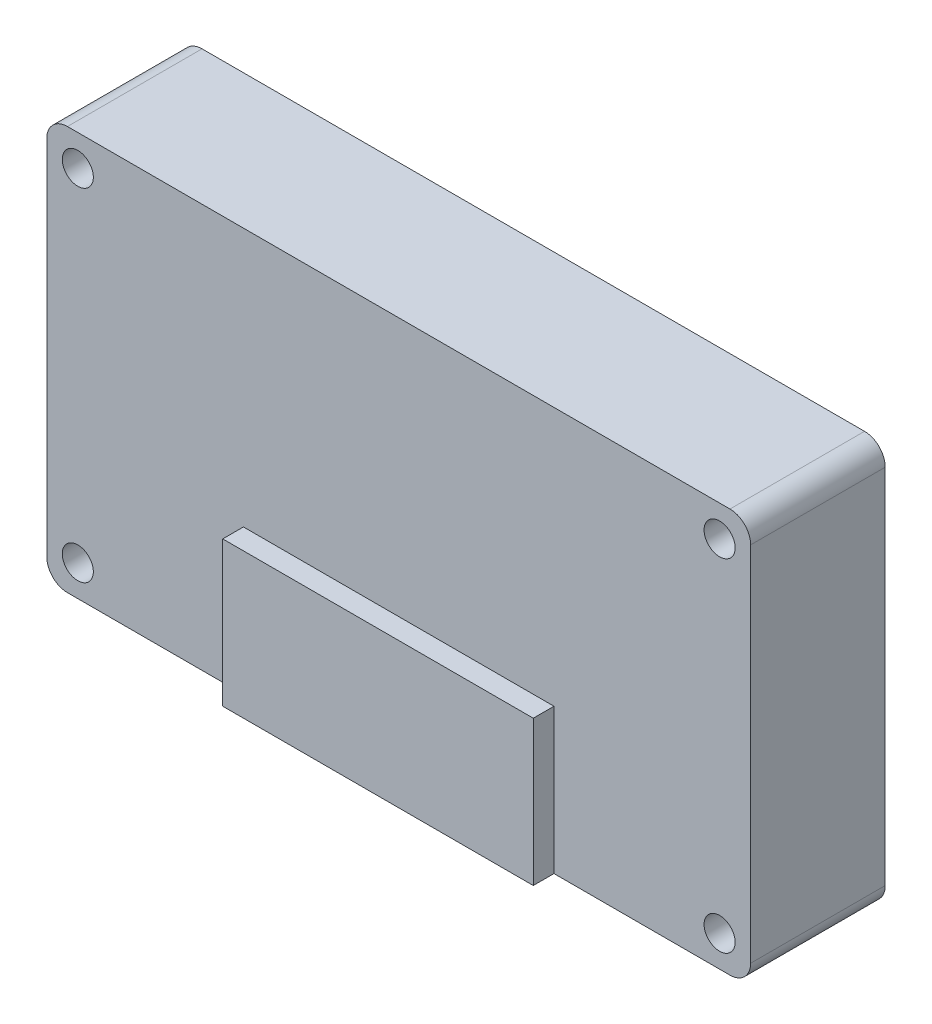
ISO-10303-21;
HEADER;
FILE_DESCRIPTION(('STEP AP214'),'2;1');
FILE_NAME('part.step','',(''),(''),'','','');
FILE_SCHEMA(('AUTOMOTIVE_DESIGN { 1 0 10303 214 1 1 1 1 }'));
ENDSEC;
DATA;
#1=APPLICATION_CONTEXT('core data for automotive mechanical design processes');
#2=APPLICATION_PROTOCOL_DEFINITION('international standard','automotive_design',2000,#1);
#3=PRODUCT_CONTEXT('',#1,'mechanical');
#4=PRODUCT('Part','Part','',(#3));
#5=PRODUCT_RELATED_PRODUCT_CATEGORY('part','',(#4));
#6=PRODUCT_DEFINITION_FORMATION('','',#4);
#7=PRODUCT_DEFINITION_CONTEXT('part definition',#1,'design');
#8=PRODUCT_DEFINITION('design','',#6,#7);
#9=PRODUCT_DEFINITION_SHAPE('','',#8);
#10=(LENGTH_UNIT() NAMED_UNIT(*) SI_UNIT(.MILLI.,.METRE.));
#11=(NAMED_UNIT(*) PLANE_ANGLE_UNIT() SI_UNIT($,.RADIAN.));
#12=(NAMED_UNIT(*) SI_UNIT($,.STERADIAN.) SOLID_ANGLE_UNIT());
#13=UNCERTAINTY_MEASURE_WITH_UNIT(LENGTH_MEASURE(1.E-05),#10,'distance_accuracy_value','');
#14=(GEOMETRIC_REPRESENTATION_CONTEXT(3) GLOBAL_UNCERTAINTY_ASSIGNED_CONTEXT((#13)) GLOBAL_UNIT_ASSIGNED_CONTEXT((#10,
#11,#12)) REPRESENTATION_CONTEXT('',''));
#15=CARTESIAN_POINT('',(0.,0.,0.));
#16=DIRECTION('',(0.,0.,1.));
#17=DIRECTION('',(1.,0.,0.));
#18=AXIS2_PLACEMENT_3D('',#15,#16,#17);
#19=CARTESIAN_POINT('',(0.,0.,13.));
#20=DIRECTION('',(0.,0.,-1.));
#21=DIRECTION('',(-1.,0.,0.));
#22=AXIS2_PLACEMENT_3D('',#19,#20,#21);
#23=PLANE('',#22);
#24=CARTESIAN_POINT('',(65.,3.,13.));
#25=DIRECTION('',(0.,0.,1.));
#26=DIRECTION('',(-1.,0.,0.));
#27=AXIS2_PLACEMENT_3D('',#24,#25,#26);
#28=CIRCLE('',#27,1.5);
#29=CARTESIAN_POINT('',(63.5,3.,13.));
#30=VERTEX_POINT('',#29);
#31=EDGE_CURVE('E161',#30,#30,#28,.T.);
#32=ORIENTED_EDGE('',*,*,#31,.F.);
#33=EDGE_LOOP('',(#32));
#34=FACE_BOUND('',#33,.T.);
#35=CARTESIAN_POINT('',(65.,36.,13.));
#36=DIRECTION('',(0.,0.,1.));
#37=DIRECTION('',(-1.,0.,0.));
#38=AXIS2_PLACEMENT_3D('',#35,#36,#37);
#39=CIRCLE('',#38,1.5);
#40=CARTESIAN_POINT('',(63.5,36.,13.));
#41=VERTEX_POINT('',#40);
#42=EDGE_CURVE('E170',#41,#41,#39,.T.);
#43=ORIENTED_EDGE('',*,*,#42,.F.);
#44=EDGE_LOOP('',(#43));
#45=FACE_BOUND('',#44,.T.);
#46=CARTESIAN_POINT('',(3.,3.,13.));
#47=DIRECTION('',(0.,0.,1.));
#48=DIRECTION('',(1.,0.,0.));
#49=AXIS2_PLACEMENT_3D('',#46,#47,#48);
#50=CIRCLE('',#49,1.5);
#51=CARTESIAN_POINT('',(1.5,3.,13.));
#52=VERTEX_POINT('',#51);
#53=EDGE_CURVE('E176',#52,#52,#50,.T.);
#54=ORIENTED_EDGE('',*,*,#53,.F.);
#55=EDGE_LOOP('',(#54));
#56=FACE_BOUND('',#55,.T.);
#57=CARTESIAN_POINT('',(3.,36.,13.));
#58=DIRECTION('',(0.,0.,1.));
#59=DIRECTION('',(1.,0.,0.));
#60=AXIS2_PLACEMENT_3D('',#57,#58,#59);
#61=CIRCLE('',#60,1.5);
#62=CARTESIAN_POINT('',(1.5,36.,13.));
#63=VERTEX_POINT('',#62);
#64=EDGE_CURVE('E182',#63,#63,#61,.T.);
#65=ORIENTED_EDGE('',*,*,#64,.F.);
#66=EDGE_LOOP('',(#65));
#67=FACE_BOUND('',#66,.T.);
#68=DIRECTION('',(0.,-1.,0.));
#69=VECTOR('',#68,1.);
#70=CARTESIAN_POINT('',(19.,14.,13.));
#71=LINE('',#70,#69);
#72=CARTESIAN_POINT('',(19.,14.,13.));
#73=VERTEX_POINT('',#72);
#74=CARTESIAN_POINT('',(19.,0.,13.));
#75=VERTEX_POINT('',#74);
#76=EDGE_CURVE('E62',#73,#75,#71,.T.);
#77=ORIENTED_EDGE('',*,*,#76,.F.);
#78=DIRECTION('',(-1.,0.,0.));
#79=VECTOR('',#78,1.);
#80=CARTESIAN_POINT('',(19.,14.,13.));
#81=LINE('',#80,#79);
#82=CARTESIAN_POINT('',(49.,14.,13.));
#83=VERTEX_POINT('',#82);
#84=EDGE_CURVE('E155',#83,#73,#81,.T.);
#85=ORIENTED_EDGE('',*,*,#84,.F.);
#86=DIRECTION('',(0.,1.,0.));
#87=VECTOR('',#86,1.);
#88=CARTESIAN_POINT('',(49.,14.,13.));
#89=LINE('',#88,#87);
#90=CARTESIAN_POINT('',(49.,0.,13.));
#91=VERTEX_POINT('',#90);
#92=EDGE_CURVE('E68',#91,#83,#89,.T.);
#93=ORIENTED_EDGE('',*,*,#92,.F.);
#94=DIRECTION('',(1.,0.,0.));
#95=VECTOR('',#94,1.);
#96=CARTESIAN_POINT('',(0.,0.,13.));
#97=LINE('',#96,#95);
#98=CARTESIAN_POINT('',(66.,0.,13.));
#99=VERTEX_POINT('',#98);
#100=EDGE_CURVE('E191',#91,#99,#97,.T.);
#101=ORIENTED_EDGE('',*,*,#100,.T.);
#102=CARTESIAN_POINT('',(66.,2.,13.));
#103=DIRECTION('',(0.,0.,-1.));
#104=DIRECTION('',(-1.,0.,0.));
#105=AXIS2_PLACEMENT_3D('',#102,#103,#104);
#106=CIRCLE('',#105,2.);
#107=CARTESIAN_POINT('',(68.,2.,13.));
#108=VERTEX_POINT('',#107);
#109=EDGE_CURVE('E234',#99,#108,#106,.F.);
#110=ORIENTED_EDGE('',*,*,#109,.T.);
#111=DIRECTION('',(0.,1.,0.));
#112=VECTOR('',#111,1.);
#113=CARTESIAN_POINT('',(68.,0.,13.));
#114=LINE('',#113,#112);
#115=CARTESIAN_POINT('',(68.,37.,13.));
#116=VERTEX_POINT('',#115);
#117=EDGE_CURVE('E195',#108,#116,#114,.T.);
#118=ORIENTED_EDGE('',*,*,#117,.T.);
#119=CARTESIAN_POINT('',(66.,37.,13.));
#120=DIRECTION('',(0.,0.,-1.));
#121=DIRECTION('',(-1.,0.,0.));
#122=AXIS2_PLACEMENT_3D('',#119,#120,#121);
#123=CIRCLE('',#122,2.);
#124=CARTESIAN_POINT('',(66.,39.,13.));
#125=VERTEX_POINT('',#124);
#126=EDGE_CURVE('E232',#116,#125,#123,.F.);
#127=ORIENTED_EDGE('',*,*,#126,.T.);
#128=DIRECTION('',(-1.,0.,0.));
#129=VECTOR('',#128,1.);
#130=CARTESIAN_POINT('',(0.,39.,13.));
#131=LINE('',#130,#129);
#132=CARTESIAN_POINT('',(2.,39.,13.));
#133=VERTEX_POINT('',#132);
#134=EDGE_CURVE('E198',#125,#133,#131,.T.);
#135=ORIENTED_EDGE('',*,*,#134,.T.);
#136=CARTESIAN_POINT('',(2.,37.,13.));
#137=DIRECTION('',(0.,0.,-1.));
#138=DIRECTION('',(-1.,0.,0.));
#139=AXIS2_PLACEMENT_3D('',#136,#137,#138);
#140=CIRCLE('',#139,2.);
#141=CARTESIAN_POINT('',(0.,37.,13.));
#142=VERTEX_POINT('',#141);
#143=EDGE_CURVE('E230',#133,#142,#140,.F.);
#144=ORIENTED_EDGE('',*,*,#143,.T.);
#145=DIRECTION('',(0.,-1.,0.));
#146=VECTOR('',#145,1.);
#147=CARTESIAN_POINT('',(0.,0.,13.));
#148=LINE('',#147,#146);
#149=CARTESIAN_POINT('',(0.,2.,13.));
#150=VERTEX_POINT('',#149);
#151=EDGE_CURVE('E188',#142,#150,#148,.T.);
#152=ORIENTED_EDGE('',*,*,#151,.T.);
#153=CARTESIAN_POINT('',(2.,2.,13.));
#154=DIRECTION('',(0.,0.,-1.));
#155=DIRECTION('',(-1.,0.,0.));
#156=AXIS2_PLACEMENT_3D('',#153,#154,#155);
#157=CIRCLE('',#156,2.);
#158=CARTESIAN_POINT('',(2.,0.,13.));
#159=VERTEX_POINT('',#158);
#160=EDGE_CURVE('E236',#150,#159,#157,.F.);
#161=ORIENTED_EDGE('',*,*,#160,.T.);
#162=EDGE_CURVE('E193',#159,#75,#97,.T.);
#163=ORIENTED_EDGE('',*,*,#162,.T.);
#164=EDGE_LOOP('',(#77,#85,#93,#101,#110,#118,#127,#135,#144,#152,#161,#163));
#165=FACE_BOUND('',#164,.T.);
#166=ADVANCED_FACE('F47',(#34,#45,#56,#67,#165),#23,.F.);
#167=CARTESIAN_POINT('',(0.,0.,0.));
#168=DIRECTION('',(0.,0.,-1.));
#169=DIRECTION('',(-1.,0.,0.));
#170=AXIS2_PLACEMENT_3D('',#167,#168,#169);
#171=PLANE('',#170);
#172=CARTESIAN_POINT('',(65.,36.,0.));
#173=DIRECTION('',(0.,0.,1.));
#174=DIRECTION('',(-1.,0.,0.));
#175=AXIS2_PLACEMENT_3D('',#172,#173,#174);
#176=CIRCLE('',#175,1.5);
#177=CARTESIAN_POINT('',(63.5,36.,0.));
#178=VERTEX_POINT('',#177);
#179=EDGE_CURVE('E168',#178,#178,#176,.T.);
#180=ORIENTED_EDGE('',*,*,#179,.T.);
#181=EDGE_LOOP('',(#180));
#182=FACE_BOUND('',#181,.T.);
#183=CARTESIAN_POINT('',(3.,36.,0.));
#184=DIRECTION('',(0.,0.,1.));
#185=DIRECTION('',(1.,0.,0.));
#186=AXIS2_PLACEMENT_3D('',#183,#184,#185);
#187=CIRCLE('',#186,1.5);
#188=CARTESIAN_POINT('',(1.5,36.,0.));
#189=VERTEX_POINT('',#188);
#190=EDGE_CURVE('E179',#189,#189,#187,.T.);
#191=ORIENTED_EDGE('',*,*,#190,.T.);
#192=EDGE_LOOP('',(#191));
#193=FACE_BOUND('',#192,.T.);
#194=DIRECTION('',(1.,0.,0.));
#195=VECTOR('',#194,1.);
#196=CARTESIAN_POINT('',(0.,0.,0.));
#197=LINE('',#196,#195);
#198=CARTESIAN_POINT('',(2.,0.,0.));
#199=VERTEX_POINT('',#198);
#200=CARTESIAN_POINT('',(66.,0.,0.));
#201=VERTEX_POINT('',#200);
#202=EDGE_CURVE('E204',#199,#201,#197,.T.);
#203=ORIENTED_EDGE('',*,*,#202,.F.);
#204=CARTESIAN_POINT('',(2.,2.,0.));
#205=DIRECTION('',(0.,0.,-1.));
#206=DIRECTION('',(-1.,0.,0.));
#207=AXIS2_PLACEMENT_3D('',#204,#205,#206);
#208=CIRCLE('',#207,2.);
#209=CARTESIAN_POINT('',(0.,2.,0.));
#210=VERTEX_POINT('',#209);
#211=EDGE_CURVE('E223',#199,#210,#208,.T.);
#212=ORIENTED_EDGE('',*,*,#211,.T.);
#213=DIRECTION('',(0.,-1.,0.));
#214=VECTOR('',#213,1.);
#215=CARTESIAN_POINT('',(0.,0.,0.));
#216=LINE('',#215,#214);
#217=CARTESIAN_POINT('',(0.,37.,0.));
#218=VERTEX_POINT('',#217);
#219=EDGE_CURVE('E185',#218,#210,#216,.T.);
#220=ORIENTED_EDGE('',*,*,#219,.F.);
#221=CARTESIAN_POINT('',(2.,37.,0.));
#222=DIRECTION('',(0.,0.,-1.));
#223=DIRECTION('',(-1.,0.,0.));
#224=AXIS2_PLACEMENT_3D('',#221,#222,#223);
#225=CIRCLE('',#224,2.);
#226=CARTESIAN_POINT('',(2.,39.,0.));
#227=VERTEX_POINT('',#226);
#228=EDGE_CURVE('E217',#218,#227,#225,.T.);
#229=ORIENTED_EDGE('',*,*,#228,.T.);
#230=DIRECTION('',(-1.,0.,0.));
#231=VECTOR('',#230,1.);
#232=CARTESIAN_POINT('',(0.,39.,0.));
#233=LINE('',#232,#231);
#234=CARTESIAN_POINT('',(66.,39.,0.));
#235=VERTEX_POINT('',#234);
#236=EDGE_CURVE('E192',#235,#227,#233,.T.);
#237=ORIENTED_EDGE('',*,*,#236,.F.);
#238=CARTESIAN_POINT('',(66.,37.,0.));
#239=DIRECTION('',(0.,0.,-1.));
#240=DIRECTION('',(-1.,0.,0.));
#241=AXIS2_PLACEMENT_3D('',#238,#239,#240);
#242=CIRCLE('',#241,2.);
#243=CARTESIAN_POINT('',(68.,37.,0.));
#244=VERTEX_POINT('',#243);
#245=EDGE_CURVE('E219',#235,#244,#242,.T.);
#246=ORIENTED_EDGE('',*,*,#245,.T.);
#247=DIRECTION('',(0.,1.,0.));
#248=VECTOR('',#247,1.);
#249=CARTESIAN_POINT('',(68.,0.,0.));
#250=LINE('',#249,#248);
#251=CARTESIAN_POINT('',(68.,2.,0.));
#252=VERTEX_POINT('',#251);
#253=EDGE_CURVE('E207',#252,#244,#250,.T.);
#254=ORIENTED_EDGE('',*,*,#253,.F.);
#255=CARTESIAN_POINT('',(66.,2.,0.));
#256=DIRECTION('',(0.,0.,-1.));
#257=DIRECTION('',(-1.,0.,0.));
#258=AXIS2_PLACEMENT_3D('',#255,#256,#257);
#259=CIRCLE('',#258,2.);
#260=EDGE_CURVE('E221',#252,#201,#259,.T.);
#261=ORIENTED_EDGE('',*,*,#260,.T.);
#262=EDGE_LOOP('',(#203,#212,#220,#229,#237,#246,#254,#261));
#263=FACE_BOUND('',#262,.T.);
#264=CARTESIAN_POINT('',(3.,3.,0.));
#265=DIRECTION('',(0.,0.,1.));
#266=DIRECTION('',(1.,0.,0.));
#267=AXIS2_PLACEMENT_3D('',#264,#265,#266);
#268=CIRCLE('',#267,1.5);
#269=CARTESIAN_POINT('',(1.5,3.,0.));
#270=VERTEX_POINT('',#269);
#271=EDGE_CURVE('E173',#270,#270,#268,.T.);
#272=ORIENTED_EDGE('',*,*,#271,.T.);
#273=EDGE_LOOP('',(#272));
#274=FACE_BOUND('',#273,.T.);
#275=CARTESIAN_POINT('',(65.,3.,0.));
#276=DIRECTION('',(0.,0.,1.));
#277=DIRECTION('',(-1.,0.,0.));
#278=AXIS2_PLACEMENT_3D('',#275,#276,#277);
#279=CIRCLE('',#278,1.5);
#280=CARTESIAN_POINT('',(63.5,3.,0.));
#281=VERTEX_POINT('',#280);
#282=EDGE_CURVE('E158',#281,#281,#279,.T.);
#283=ORIENTED_EDGE('',*,*,#282,.T.);
#284=EDGE_LOOP('',(#283));
#285=FACE_BOUND('',#284,.T.);
#286=ADVANCED_FACE('F259',(#182,#193,#263,#274,#285),#171,.T.);
#287=CARTESIAN_POINT('',(0.,0.,13.));
#288=DIRECTION('',(1.,0.,0.));
#289=DIRECTION('',(0.,0.,-1.));
#290=AXIS2_PLACEMENT_3D('',#287,#288,#289);
#291=PLANE('',#290);
#292=ORIENTED_EDGE('',*,*,#219,.T.);
#293=DIRECTION('',(0.,0.,-1.));
#294=VECTOR('',#293,1.);
#295=CARTESIAN_POINT('',(0.,2.,13.));
#296=LINE('',#295,#294);
#297=EDGE_CURVE('E228',#210,#150,#296,.F.);
#298=ORIENTED_EDGE('',*,*,#297,.T.);
#299=ORIENTED_EDGE('',*,*,#151,.F.);
#300=DIRECTION('',(0.,0.,-1.));
#301=VECTOR('',#300,1.);
#302=CARTESIAN_POINT('',(0.,37.,13.));
#303=LINE('',#302,#301);
#304=EDGE_CURVE('E225',#142,#218,#303,.T.);
#305=ORIENTED_EDGE('',*,*,#304,.T.);
#306=EDGE_LOOP('',(#292,#298,#299,#305));
#307=FACE_BOUND('',#306,.T.);
#308=ADVANCED_FACE('F255',(#307),#291,.F.);
#309=CARTESIAN_POINT('',(0.,0.,13.));
#310=DIRECTION('',(0.,1.,0.));
#311=DIRECTION('',(0.,0.,1.));
#312=AXIS2_PLACEMENT_3D('',#309,#310,#311);
#313=PLANE('',#312);
#314=ORIENTED_EDGE('',*,*,#162,.F.);
#315=DIRECTION('',(0.,0.,-1.));
#316=VECTOR('',#315,1.);
#317=CARTESIAN_POINT('',(2.,0.,13.));
#318=LINE('',#317,#316);
#319=EDGE_CURVE('E214',#159,#199,#318,.T.);
#320=ORIENTED_EDGE('',*,*,#319,.T.);
#321=ORIENTED_EDGE('',*,*,#202,.T.);
#322=DIRECTION('',(0.,0.,-1.));
#323=VECTOR('',#322,1.);
#324=CARTESIAN_POINT('',(66.,0.,13.));
#325=LINE('',#324,#323);
#326=EDGE_CURVE('E201',#201,#99,#325,.F.);
#327=ORIENTED_EDGE('',*,*,#326,.T.);
#328=ORIENTED_EDGE('',*,*,#100,.F.);
#329=DIRECTION('',(0.,0.,-1.));
#330=VECTOR('',#329,1.);
#331=CARTESIAN_POINT('',(49.,0.,15.));
#332=LINE('',#331,#330);
#333=CARTESIAN_POINT('',(49.,0.,15.));
#334=VERTEX_POINT('',#333);
#335=EDGE_CURVE('E142',#334,#91,#332,.T.);
#336=ORIENTED_EDGE('',*,*,#335,.F.);
#337=DIRECTION('',(1.,0.,0.));
#338=VECTOR('',#337,1.);
#339=CARTESIAN_POINT('',(19.,0.,15.));
#340=LINE('',#339,#338);
#341=CARTESIAN_POINT('',(19.,0.,15.));
#342=VERTEX_POINT('',#341);
#343=EDGE_CURVE('E135',#342,#334,#340,.T.);
#344=ORIENTED_EDGE('',*,*,#343,.F.);
#345=DIRECTION('',(0.,0.,-1.));
#346=VECTOR('',#345,1.);
#347=CARTESIAN_POINT('',(19.,0.,15.));
#348=LINE('',#347,#346);
#349=EDGE_CURVE('E140',#342,#75,#348,.T.);
#350=ORIENTED_EDGE('',*,*,#349,.T.);
#351=EDGE_LOOP('',(#314,#320,#321,#327,#328,#336,#344,#350));
#352=FACE_BOUND('',#351,.T.);
#353=ADVANCED_FACE('F138',(#352),#313,.F.);
#354=CARTESIAN_POINT('',(68.,0.,13.));
#355=DIRECTION('',(-1.,0.,0.));
#356=DIRECTION('',(0.,0.,1.));
#357=AXIS2_PLACEMENT_3D('',#354,#355,#356);
#358=PLANE('',#357);
#359=ORIENTED_EDGE('',*,*,#117,.F.);
#360=DIRECTION('',(0.,0.,-1.));
#361=VECTOR('',#360,1.);
#362=CARTESIAN_POINT('',(68.,2.,13.));
#363=LINE('',#362,#361);
#364=EDGE_CURVE('E240',#108,#252,#363,.T.);
#365=ORIENTED_EDGE('',*,*,#364,.T.);
#366=ORIENTED_EDGE('',*,*,#253,.T.);
#367=DIRECTION('',(0.,0.,-1.));
#368=VECTOR('',#367,1.);
#369=CARTESIAN_POINT('',(68.,37.,13.));
#370=LINE('',#369,#368);
#371=EDGE_CURVE('E238',#244,#116,#370,.F.);
#372=ORIENTED_EDGE('',*,*,#371,.T.);
#373=EDGE_LOOP('',(#359,#365,#366,#372));
#374=FACE_BOUND('',#373,.T.);
#375=ADVANCED_FACE('F272',(#374),#358,.F.);
#376=CARTESIAN_POINT('',(0.,39.,13.));
#377=DIRECTION('',(0.,-1.,0.));
#378=DIRECTION('',(0.,0.,-1.));
#379=AXIS2_PLACEMENT_3D('',#376,#377,#378);
#380=PLANE('',#379);
#381=ORIENTED_EDGE('',*,*,#134,.F.);
#382=DIRECTION('',(0.,0.,-1.));
#383=VECTOR('',#382,1.);
#384=CARTESIAN_POINT('',(66.,39.,13.));
#385=LINE('',#384,#383);
#386=EDGE_CURVE('E11',#125,#235,#385,.T.);
#387=ORIENTED_EDGE('',*,*,#386,.T.);
#388=ORIENTED_EDGE('',*,*,#236,.T.);
#389=DIRECTION('',(0.,0.,-1.));
#390=VECTOR('',#389,1.);
#391=CARTESIAN_POINT('',(2.,39.,13.));
#392=LINE('',#391,#390);
#393=EDGE_CURVE('E55',#227,#133,#392,.F.);
#394=ORIENTED_EDGE('',*,*,#393,.T.);
#395=EDGE_LOOP('',(#381,#387,#388,#394));
#396=FACE_BOUND('',#395,.T.);
#397=ADVANCED_FACE('F245',(#396),#380,.F.);
#398=CARTESIAN_POINT('',(3.,36.,13.));
#399=DIRECTION('',(0.,0.,-1.));
#400=DIRECTION('',(-1.,0.,0.));
#401=AXIS2_PLACEMENT_3D('',#398,#399,#400);
#402=CYLINDRICAL_SURFACE('',#401,1.5);
#403=CARTESIAN_POINT('',(1.5,36.,13.));
#404=CARTESIAN_POINT('',(1.5,36.,12.8645833333333));
#405=CARTESIAN_POINT('',(1.5,36.,12.7291666666667));
#406=CARTESIAN_POINT('',(1.5,36.,12.4583333333333));
#407=CARTESIAN_POINT('',(1.5,36.,12.3229166666667));
#408=CARTESIAN_POINT('',(1.5,36.,12.0520833333333));
#409=CARTESIAN_POINT('',(1.5,36.,11.9166666666667));
#410=CARTESIAN_POINT('',(1.5,36.,11.6458333333333));
#411=CARTESIAN_POINT('',(1.5,36.,11.5104166666667));
#412=CARTESIAN_POINT('',(1.5,36.,11.2395833333333));
#413=CARTESIAN_POINT('',(1.5,36.,11.1041666666667));
#414=CARTESIAN_POINT('',(1.5,36.,10.8333333333333));
#415=CARTESIAN_POINT('',(1.5,36.,10.6979166666667));
#416=CARTESIAN_POINT('',(1.5,36.,10.4270833333333));
#417=CARTESIAN_POINT('',(1.5,36.,10.2916666666667));
#418=CARTESIAN_POINT('',(1.5,36.,10.0208333333333));
#419=CARTESIAN_POINT('',(1.5,36.,9.88541666666667));
#420=CARTESIAN_POINT('',(1.5,36.,9.61458333333333));
#421=CARTESIAN_POINT('',(1.5,36.,9.47916666666667));
#422=CARTESIAN_POINT('',(1.5,36.,9.20833333333333));
#423=CARTESIAN_POINT('',(1.5,36.,9.07291666666666));
#424=CARTESIAN_POINT('',(1.5,36.,8.80208333333333));
#425=CARTESIAN_POINT('',(1.5,36.,8.66666666666667));
#426=CARTESIAN_POINT('',(1.5,36.,8.39583333333333));
#427=CARTESIAN_POINT('',(1.5,36.,8.26041666666667));
#428=CARTESIAN_POINT('',(1.5,36.,7.98958333333333));
#429=CARTESIAN_POINT('',(1.5,36.,7.85416666666667));
#430=CARTESIAN_POINT('',(1.5,36.,7.58333333333333));
#431=CARTESIAN_POINT('',(1.5,36.,7.44791666666667));
#432=CARTESIAN_POINT('',(1.5,36.,7.17708333333333));
#433=CARTESIAN_POINT('',(1.5,36.,7.04166666666667));
#434=CARTESIAN_POINT('',(1.5,36.,6.77083333333333));
#435=CARTESIAN_POINT('',(1.5,36.,6.63541666666667));
#436=CARTESIAN_POINT('',(1.5,36.,6.36458333333333));
#437=CARTESIAN_POINT('',(1.5,36.,6.22916666666667));
#438=CARTESIAN_POINT('',(1.5,36.,5.95833333333333));
#439=CARTESIAN_POINT('',(1.5,36.,5.82291666666667));
#440=CARTESIAN_POINT('',(1.5,36.,5.55208333333333));
#441=CARTESIAN_POINT('',(1.5,36.,5.41666666666667));
#442=CARTESIAN_POINT('',(1.5,36.,5.14583333333333));
#443=CARTESIAN_POINT('',(1.5,36.,5.01041666666667));
#444=CARTESIAN_POINT('',(1.5,36.,4.73958333333333));
#445=CARTESIAN_POINT('',(1.5,36.,4.60416666666667));
#446=CARTESIAN_POINT('',(1.5,36.,4.33333333333333));
#447=CARTESIAN_POINT('',(1.5,36.,4.19791666666667));
#448=CARTESIAN_POINT('',(1.5,36.,3.92708333333333));
#449=CARTESIAN_POINT('',(1.5,36.,3.79166666666667));
#450=CARTESIAN_POINT('',(1.5,36.,3.52083333333333));
#451=CARTESIAN_POINT('',(1.5,36.,3.38541666666667));
#452=CARTESIAN_POINT('',(1.5,36.,3.11458333333333));
#453=CARTESIAN_POINT('',(1.5,36.,2.97916666666667));
#454=CARTESIAN_POINT('',(1.5,36.,2.70833333333333));
#455=CARTESIAN_POINT('',(1.5,36.,2.57291666666667));
#456=CARTESIAN_POINT('',(1.5,36.,2.30208333333333));
#457=CARTESIAN_POINT('',(1.5,36.,2.16666666666667));
#458=CARTESIAN_POINT('',(1.5,36.,1.89583333333333));
#459=CARTESIAN_POINT('',(1.5,36.,1.76041666666667));
#460=CARTESIAN_POINT('',(1.5,36.,1.48958333333333));
#461=CARTESIAN_POINT('',(1.5,36.,1.35416666666667));
#462=CARTESIAN_POINT('',(1.5,36.,1.08333333333333));
#463=CARTESIAN_POINT('',(1.5,36.,0.947916666666667));
#464=CARTESIAN_POINT('',(1.5,36.,0.677083333333334));
#465=CARTESIAN_POINT('',(1.5,36.,0.541666666666667));
#466=CARTESIAN_POINT('',(1.5,36.,0.270833333333334));
#467=CARTESIAN_POINT('',(1.5,36.,0.135416666666667));
#468=CARTESIAN_POINT('',(1.5,36.,0.));
#469=B_SPLINE_CURVE_WITH_KNOTS('',3,(#403,#404,#405,#406,#407,#408,#409,#410,#411,#412,#413,
#414,#415,#416,#417,#418,#419,#420,#421,#422,#423,#424,#425,#426,#427,#428,#429,#430,#431,#432,
#433,#434,#435,#436,#437,#438,#439,#440,#441,#442,#443,#444,#445,#446,#447,#448,#449,#450,#451,
#452,#453,#454,#455,#456,#457,#458,#459,#460,#461,#462,#463,#464,#465,#466,#467,#468),
.UNSPECIFIED.,.F.,.F.,(4,2,2,2,2,2,2,2,2,2,2,2,2,2,2,2,2,2,2,2,2,2,2,2,2,2,2,2,2,2,2,2,4),(0.,
0.40625,0.812500000000001,1.21875,1.625,2.03125,2.4375,2.84375,3.25,3.65625,4.0625,4.46875,
4.875,5.28125,5.6875,6.09375,6.5,6.90625,7.3125,7.71875,8.125,8.53125,8.9375,9.34375,9.75,
10.15625,10.5625,10.96875,11.375,11.78125,12.1875,12.59375,13.),.UNSPECIFIED.);
#470=EDGE_CURVE('BSEAM295',#63,#189,#469,.T.);
#471=ORIENTED_EDGE('',*,*,#64,.T.);
#472=ORIENTED_EDGE('',*,*,#190,.F.);
#473=ORIENTED_EDGE('',*,*,#470,.T.);
#474=ORIENTED_EDGE('',*,*,#470,.F.);
#475=EDGE_LOOP('',(#471,#473,#472,#474));
#476=FACE_BOUND('',#475,.T.);
#477=ADVANCED_FACE('F295',(#476),#402,.F.);
#478=CARTESIAN_POINT('',(3.,3.,13.));
#479=DIRECTION('',(0.,0.,-1.));
#480=DIRECTION('',(-1.,0.,0.));
#481=AXIS2_PLACEMENT_3D('',#478,#479,#480);
#482=CYLINDRICAL_SURFACE('',#481,1.5);
#483=CARTESIAN_POINT('',(1.5,3.,13.));
#484=CARTESIAN_POINT('',(1.5,3.,12.8645833333333));
#485=CARTESIAN_POINT('',(1.5,3.,12.7291666666667));
#486=CARTESIAN_POINT('',(1.5,3.,12.4583333333333));
#487=CARTESIAN_POINT('',(1.5,3.,12.3229166666667));
#488=CARTESIAN_POINT('',(1.5,3.,12.0520833333333));
#489=CARTESIAN_POINT('',(1.5,3.,11.9166666666667));
#490=CARTESIAN_POINT('',(1.5,3.,11.6458333333333));
#491=CARTESIAN_POINT('',(1.5,3.,11.5104166666667));
#492=CARTESIAN_POINT('',(1.5,3.,11.2395833333333));
#493=CARTESIAN_POINT('',(1.5,3.,11.1041666666667));
#494=CARTESIAN_POINT('',(1.5,3.,10.8333333333333));
#495=CARTESIAN_POINT('',(1.5,3.,10.6979166666667));
#496=CARTESIAN_POINT('',(1.5,3.,10.4270833333333));
#497=CARTESIAN_POINT('',(1.5,3.,10.2916666666667));
#498=CARTESIAN_POINT('',(1.5,3.,10.0208333333333));
#499=CARTESIAN_POINT('',(1.5,3.,9.88541666666667));
#500=CARTESIAN_POINT('',(1.5,3.,9.61458333333333));
#501=CARTESIAN_POINT('',(1.5,3.,9.47916666666667));
#502=CARTESIAN_POINT('',(1.5,3.,9.20833333333333));
#503=CARTESIAN_POINT('',(1.5,3.,9.07291666666666));
#504=CARTESIAN_POINT('',(1.5,3.,8.80208333333333));
#505=CARTESIAN_POINT('',(1.5,3.,8.66666666666667));
#506=CARTESIAN_POINT('',(1.5,3.,8.39583333333333));
#507=CARTESIAN_POINT('',(1.5,3.,8.26041666666667));
#508=CARTESIAN_POINT('',(1.5,3.,7.98958333333333));
#509=CARTESIAN_POINT('',(1.5,3.,7.85416666666667));
#510=CARTESIAN_POINT('',(1.5,3.,7.58333333333333));
#511=CARTESIAN_POINT('',(1.5,3.,7.44791666666667));
#512=CARTESIAN_POINT('',(1.5,3.,7.17708333333333));
#513=CARTESIAN_POINT('',(1.5,3.,7.04166666666667));
#514=CARTESIAN_POINT('',(1.5,3.,6.77083333333333));
#515=CARTESIAN_POINT('',(1.5,3.,6.63541666666667));
#516=CARTESIAN_POINT('',(1.5,3.,6.36458333333333));
#517=CARTESIAN_POINT('',(1.5,3.,6.22916666666667));
#518=CARTESIAN_POINT('',(1.5,3.,5.95833333333333));
#519=CARTESIAN_POINT('',(1.5,3.,5.82291666666667));
#520=CARTESIAN_POINT('',(1.5,3.,5.55208333333333));
#521=CARTESIAN_POINT('',(1.5,3.,5.41666666666667));
#522=CARTESIAN_POINT('',(1.5,3.,5.14583333333333));
#523=CARTESIAN_POINT('',(1.5,3.,5.01041666666667));
#524=CARTESIAN_POINT('',(1.5,3.,4.73958333333333));
#525=CARTESIAN_POINT('',(1.5,3.,4.60416666666667));
#526=CARTESIAN_POINT('',(1.5,3.,4.33333333333333));
#527=CARTESIAN_POINT('',(1.5,3.,4.19791666666667));
#528=CARTESIAN_POINT('',(1.5,3.,3.92708333333333));
#529=CARTESIAN_POINT('',(1.5,3.,3.79166666666667));
#530=CARTESIAN_POINT('',(1.5,3.,3.52083333333333));
#531=CARTESIAN_POINT('',(1.5,3.,3.38541666666667));
#532=CARTESIAN_POINT('',(1.5,3.,3.11458333333333));
#533=CARTESIAN_POINT('',(1.5,3.,2.97916666666667));
#534=CARTESIAN_POINT('',(1.5,3.,2.70833333333333));
#535=CARTESIAN_POINT('',(1.5,3.,2.57291666666667));
#536=CARTESIAN_POINT('',(1.5,3.,2.30208333333333));
#537=CARTESIAN_POINT('',(1.5,3.,2.16666666666667));
#538=CARTESIAN_POINT('',(1.5,3.,1.89583333333333));
#539=CARTESIAN_POINT('',(1.5,3.,1.76041666666667));
#540=CARTESIAN_POINT('',(1.5,3.,1.48958333333333));
#541=CARTESIAN_POINT('',(1.5,3.,1.35416666666667));
#542=CARTESIAN_POINT('',(1.5,3.,1.08333333333333));
#543=CARTESIAN_POINT('',(1.5,3.,0.947916666666667));
#544=CARTESIAN_POINT('',(1.5,3.,0.677083333333334));
#545=CARTESIAN_POINT('',(1.5,3.,0.541666666666667));
#546=CARTESIAN_POINT('',(1.5,3.,0.270833333333334));
#547=CARTESIAN_POINT('',(1.5,3.,0.135416666666667));
#548=CARTESIAN_POINT('',(1.5,3.,0.));
#549=B_SPLINE_CURVE_WITH_KNOTS('',3,(#483,#484,#485,#486,#487,#488,#489,#490,#491,#492,#493,
#494,#495,#496,#497,#498,#499,#500,#501,#502,#503,#504,#505,#506,#507,#508,#509,#510,#511,#512,
#513,#514,#515,#516,#517,#518,#519,#520,#521,#522,#523,#524,#525,#526,#527,#528,#529,#530,#531,
#532,#533,#534,#535,#536,#537,#538,#539,#540,#541,#542,#543,#544,#545,#546,#547,#548),
.UNSPECIFIED.,.F.,.F.,(4,2,2,2,2,2,2,2,2,2,2,2,2,2,2,2,2,2,2,2,2,2,2,2,2,2,2,2,2,2,2,2,4),(0.,
0.40625,0.812500000000001,1.21875,1.625,2.03125,2.4375,2.84375,3.25,3.65625,4.0625,4.46875,
4.875,5.28125,5.6875,6.09375,6.5,6.90625,7.3125,7.71875,8.125,8.53125,8.9375,9.34375,9.75,
10.15625,10.5625,10.96875,11.375,11.78125,12.1875,12.59375,13.),.UNSPECIFIED.);
#550=EDGE_CURVE('BSEAM316',#52,#270,#549,.T.);
#551=ORIENTED_EDGE('',*,*,#53,.T.);
#552=ORIENTED_EDGE('',*,*,#271,.F.);
#553=ORIENTED_EDGE('',*,*,#550,.T.);
#554=ORIENTED_EDGE('',*,*,#550,.F.);
#555=EDGE_LOOP('',(#551,#553,#552,#554));
#556=FACE_BOUND('',#555,.T.);
#557=ADVANCED_FACE('F316',(#556),#482,.F.);
#558=CARTESIAN_POINT('',(65.,36.,13.));
#559=DIRECTION('',(0.,0.,-1.));
#560=DIRECTION('',(-1.,0.,0.));
#561=AXIS2_PLACEMENT_3D('',#558,#559,#560);
#562=CYLINDRICAL_SURFACE('',#561,1.5);
#563=CARTESIAN_POINT('',(63.5,36.,13.));
#564=CARTESIAN_POINT('',(63.5,36.,12.8645833333333));
#565=CARTESIAN_POINT('',(63.5,36.,12.7291666666667));
#566=CARTESIAN_POINT('',(63.5,36.,12.4583333333333));
#567=CARTESIAN_POINT('',(63.5,36.,12.3229166666667));
#568=CARTESIAN_POINT('',(63.5,36.,12.0520833333333));
#569=CARTESIAN_POINT('',(63.5,36.,11.9166666666667));
#570=CARTESIAN_POINT('',(63.5,36.,11.6458333333333));
#571=CARTESIAN_POINT('',(63.5,36.,11.5104166666667));
#572=CARTESIAN_POINT('',(63.5,36.,11.2395833333333));
#573=CARTESIAN_POINT('',(63.5,36.,11.1041666666667));
#574=CARTESIAN_POINT('',(63.5,36.,10.8333333333333));
#575=CARTESIAN_POINT('',(63.5,36.,10.6979166666667));
#576=CARTESIAN_POINT('',(63.5,36.,10.4270833333333));
#577=CARTESIAN_POINT('',(63.5,36.,10.2916666666667));
#578=CARTESIAN_POINT('',(63.5,36.,10.0208333333333));
#579=CARTESIAN_POINT('',(63.5,36.,9.88541666666667));
#580=CARTESIAN_POINT('',(63.5,36.,9.61458333333333));
#581=CARTESIAN_POINT('',(63.5,36.,9.47916666666667));
#582=CARTESIAN_POINT('',(63.5,36.,9.20833333333333));
#583=CARTESIAN_POINT('',(63.5,36.,9.07291666666666));
#584=CARTESIAN_POINT('',(63.5,36.,8.80208333333333));
#585=CARTESIAN_POINT('',(63.5,36.,8.66666666666667));
#586=CARTESIAN_POINT('',(63.5,36.,8.39583333333333));
#587=CARTESIAN_POINT('',(63.5,36.,8.26041666666667));
#588=CARTESIAN_POINT('',(63.5,36.,7.98958333333333));
#589=CARTESIAN_POINT('',(63.5,36.,7.85416666666667));
#590=CARTESIAN_POINT('',(63.5,36.,7.58333333333333));
#591=CARTESIAN_POINT('',(63.5,36.,7.44791666666667));
#592=CARTESIAN_POINT('',(63.5,36.,7.17708333333333));
#593=CARTESIAN_POINT('',(63.5,36.,7.04166666666667));
#594=CARTESIAN_POINT('',(63.5,36.,6.77083333333333));
#595=CARTESIAN_POINT('',(63.5,36.,6.63541666666667));
#596=CARTESIAN_POINT('',(63.5,36.,6.36458333333333));
#597=CARTESIAN_POINT('',(63.5,36.,6.22916666666667));
#598=CARTESIAN_POINT('',(63.5,36.,5.95833333333333));
#599=CARTESIAN_POINT('',(63.5,36.,5.82291666666667));
#600=CARTESIAN_POINT('',(63.5,36.,5.55208333333333));
#601=CARTESIAN_POINT('',(63.5,36.,5.41666666666667));
#602=CARTESIAN_POINT('',(63.5,36.,5.14583333333333));
#603=CARTESIAN_POINT('',(63.5,36.,5.01041666666667));
#604=CARTESIAN_POINT('',(63.5,36.,4.73958333333333));
#605=CARTESIAN_POINT('',(63.5,36.,4.60416666666667));
#606=CARTESIAN_POINT('',(63.5,36.,4.33333333333333));
#607=CARTESIAN_POINT('',(63.5,36.,4.19791666666667));
#608=CARTESIAN_POINT('',(63.5,36.,3.92708333333333));
#609=CARTESIAN_POINT('',(63.5,36.,3.79166666666667));
#610=CARTESIAN_POINT('',(63.5,36.,3.52083333333333));
#611=CARTESIAN_POINT('',(63.5,36.,3.38541666666667));
#612=CARTESIAN_POINT('',(63.5,36.,3.11458333333333));
#613=CARTESIAN_POINT('',(63.5,36.,2.97916666666667));
#614=CARTESIAN_POINT('',(63.5,36.,2.70833333333333));
#615=CARTESIAN_POINT('',(63.5,36.,2.57291666666667));
#616=CARTESIAN_POINT('',(63.5,36.,2.30208333333333));
#617=CARTESIAN_POINT('',(63.5,36.,2.16666666666667));
#618=CARTESIAN_POINT('',(63.5,36.,1.89583333333333));
#619=CARTESIAN_POINT('',(63.5,36.,1.76041666666667));
#620=CARTESIAN_POINT('',(63.5,36.,1.48958333333333));
#621=CARTESIAN_POINT('',(63.5,36.,1.35416666666667));
#622=CARTESIAN_POINT('',(63.5,36.,1.08333333333333));
#623=CARTESIAN_POINT('',(63.5,36.,0.947916666666667));
#624=CARTESIAN_POINT('',(63.5,36.,0.677083333333334));
#625=CARTESIAN_POINT('',(63.5,36.,0.541666666666667));
#626=CARTESIAN_POINT('',(63.5,36.,0.270833333333334));
#627=CARTESIAN_POINT('',(63.5,36.,0.135416666666667));
#628=CARTESIAN_POINT('',(63.5,36.,0.));
#629=B_SPLINE_CURVE_WITH_KNOTS('',3,(#563,#564,#565,#566,#567,#568,#569,#570,#571,#572,#573,
#574,#575,#576,#577,#578,#579,#580,#581,#582,#583,#584,#585,#586,#587,#588,#589,#590,#591,#592,
#593,#594,#595,#596,#597,#598,#599,#600,#601,#602,#603,#604,#605,#606,#607,#608,#609,#610,#611,
#612,#613,#614,#615,#616,#617,#618,#619,#620,#621,#622,#623,#624,#625,#626,#627,#628),
.UNSPECIFIED.,.F.,.F.,(4,2,2,2,2,2,2,2,2,2,2,2,2,2,2,2,2,2,2,2,2,2,2,2,2,2,2,2,2,2,2,2,4),(0.,
0.40625,0.812500000000001,1.21875,1.625,2.03125,2.4375,2.84375,3.25,3.65625,4.0625,4.46875,
4.875,5.28125,5.6875,6.09375,6.5,6.90625,7.3125,7.71875,8.125,8.53125,8.9375,9.34375,9.75,
10.15625,10.5625,10.96875,11.375,11.78125,12.1875,12.59375,13.),.UNSPECIFIED.);
#630=EDGE_CURVE('BSEAM310',#41,#178,#629,.T.);
#631=ORIENTED_EDGE('',*,*,#42,.T.);
#632=ORIENTED_EDGE('',*,*,#179,.F.);
#633=ORIENTED_EDGE('',*,*,#630,.T.);
#634=ORIENTED_EDGE('',*,*,#630,.F.);
#635=EDGE_LOOP('',(#631,#633,#632,#634));
#636=FACE_BOUND('',#635,.T.);
#637=ADVANCED_FACE('F310',(#636),#562,.F.);
#638=CARTESIAN_POINT('',(65.,3.,13.));
#639=DIRECTION('',(0.,0.,-1.));
#640=DIRECTION('',(-1.,0.,0.));
#641=AXIS2_PLACEMENT_3D('',#638,#639,#640);
#642=CYLINDRICAL_SURFACE('',#641,1.5);
#643=CARTESIAN_POINT('',(63.5,3.,13.));
#644=CARTESIAN_POINT('',(63.5,3.,12.8645833333333));
#645=CARTESIAN_POINT('',(63.5,3.,12.7291666666667));
#646=CARTESIAN_POINT('',(63.5,3.,12.4583333333333));
#647=CARTESIAN_POINT('',(63.5,3.,12.3229166666667));
#648=CARTESIAN_POINT('',(63.5,3.,12.0520833333333));
#649=CARTESIAN_POINT('',(63.5,3.,11.9166666666667));
#650=CARTESIAN_POINT('',(63.5,3.,11.6458333333333));
#651=CARTESIAN_POINT('',(63.5,3.,11.5104166666667));
#652=CARTESIAN_POINT('',(63.5,3.,11.2395833333333));
#653=CARTESIAN_POINT('',(63.5,3.,11.1041666666667));
#654=CARTESIAN_POINT('',(63.5,3.,10.8333333333333));
#655=CARTESIAN_POINT('',(63.5,3.,10.6979166666667));
#656=CARTESIAN_POINT('',(63.5,3.,10.4270833333333));
#657=CARTESIAN_POINT('',(63.5,3.,10.2916666666667));
#658=CARTESIAN_POINT('',(63.5,3.,10.0208333333333));
#659=CARTESIAN_POINT('',(63.5,3.,9.88541666666667));
#660=CARTESIAN_POINT('',(63.5,3.,9.61458333333333));
#661=CARTESIAN_POINT('',(63.5,3.,9.47916666666667));
#662=CARTESIAN_POINT('',(63.5,3.,9.20833333333333));
#663=CARTESIAN_POINT('',(63.5,3.,9.07291666666666));
#664=CARTESIAN_POINT('',(63.5,3.,8.80208333333333));
#665=CARTESIAN_POINT('',(63.5,3.,8.66666666666667));
#666=CARTESIAN_POINT('',(63.5,3.,8.39583333333333));
#667=CARTESIAN_POINT('',(63.5,3.,8.26041666666667));
#668=CARTESIAN_POINT('',(63.5,3.,7.98958333333333));
#669=CARTESIAN_POINT('',(63.5,3.,7.85416666666667));
#670=CARTESIAN_POINT('',(63.5,3.,7.58333333333333));
#671=CARTESIAN_POINT('',(63.5,3.,7.44791666666667));
#672=CARTESIAN_POINT('',(63.5,3.,7.17708333333333));
#673=CARTESIAN_POINT('',(63.5,3.,7.04166666666667));
#674=CARTESIAN_POINT('',(63.5,3.,6.77083333333333));
#675=CARTESIAN_POINT('',(63.5,3.,6.63541666666667));
#676=CARTESIAN_POINT('',(63.5,3.,6.36458333333333));
#677=CARTESIAN_POINT('',(63.5,3.,6.22916666666667));
#678=CARTESIAN_POINT('',(63.5,3.,5.95833333333333));
#679=CARTESIAN_POINT('',(63.5,3.,5.82291666666667));
#680=CARTESIAN_POINT('',(63.5,3.,5.55208333333333));
#681=CARTESIAN_POINT('',(63.5,3.,5.41666666666667));
#682=CARTESIAN_POINT('',(63.5,3.,5.14583333333333));
#683=CARTESIAN_POINT('',(63.5,3.,5.01041666666667));
#684=CARTESIAN_POINT('',(63.5,3.,4.73958333333333));
#685=CARTESIAN_POINT('',(63.5,3.,4.60416666666667));
#686=CARTESIAN_POINT('',(63.5,3.,4.33333333333333));
#687=CARTESIAN_POINT('',(63.5,3.,4.19791666666667));
#688=CARTESIAN_POINT('',(63.5,3.,3.92708333333333));
#689=CARTESIAN_POINT('',(63.5,3.,3.79166666666667));
#690=CARTESIAN_POINT('',(63.5,3.,3.52083333333333));
#691=CARTESIAN_POINT('',(63.5,3.,3.38541666666667));
#692=CARTESIAN_POINT('',(63.5,3.,3.11458333333333));
#693=CARTESIAN_POINT('',(63.5,3.,2.97916666666667));
#694=CARTESIAN_POINT('',(63.5,3.,2.70833333333333));
#695=CARTESIAN_POINT('',(63.5,3.,2.57291666666667));
#696=CARTESIAN_POINT('',(63.5,3.,2.30208333333333));
#697=CARTESIAN_POINT('',(63.5,3.,2.16666666666667));
#698=CARTESIAN_POINT('',(63.5,3.,1.89583333333333));
#699=CARTESIAN_POINT('',(63.5,3.,1.76041666666667));
#700=CARTESIAN_POINT('',(63.5,3.,1.48958333333333));
#701=CARTESIAN_POINT('',(63.5,3.,1.35416666666667));
#702=CARTESIAN_POINT('',(63.5,3.,1.08333333333333));
#703=CARTESIAN_POINT('',(63.5,3.,0.947916666666667));
#704=CARTESIAN_POINT('',(63.5,3.,0.677083333333334));
#705=CARTESIAN_POINT('',(63.5,3.,0.541666666666667));
#706=CARTESIAN_POINT('',(63.5,3.,0.270833333333334));
#707=CARTESIAN_POINT('',(63.5,3.,0.135416666666667));
#708=CARTESIAN_POINT('',(63.5,3.,0.));
#709=B_SPLINE_CURVE_WITH_KNOTS('',3,(#643,#644,#645,#646,#647,#648,#649,#650,#651,#652,#653,
#654,#655,#656,#657,#658,#659,#660,#661,#662,#663,#664,#665,#666,#667,#668,#669,#670,#671,#672,
#673,#674,#675,#676,#677,#678,#679,#680,#681,#682,#683,#684,#685,#686,#687,#688,#689,#690,#691,
#692,#693,#694,#695,#696,#697,#698,#699,#700,#701,#702,#703,#704,#705,#706,#707,#708),
.UNSPECIFIED.,.F.,.F.,(4,2,2,2,2,2,2,2,2,2,2,2,2,2,2,2,2,2,2,2,2,2,2,2,2,2,2,2,2,2,2,2,4),(0.,
0.40625,0.812500000000001,1.21875,1.625,2.03125,2.4375,2.84375,3.25,3.65625,4.0625,4.46875,
4.875,5.28125,5.6875,6.09375,6.5,6.90625,7.3125,7.71875,8.125,8.53125,8.9375,9.34375,9.75,
10.15625,10.5625,10.96875,11.375,11.78125,12.1875,12.59375,13.),.UNSPECIFIED.);
#710=EDGE_CURVE('BSEAM306',#30,#281,#709,.T.);
#711=ORIENTED_EDGE('',*,*,#31,.T.);
#712=ORIENTED_EDGE('',*,*,#282,.F.);
#713=ORIENTED_EDGE('',*,*,#710,.T.);
#714=ORIENTED_EDGE('',*,*,#710,.F.);
#715=EDGE_LOOP('',(#711,#713,#712,#714));
#716=FACE_BOUND('',#715,.T.);
#717=ADVANCED_FACE('F306',(#716),#642,.F.);
#718=CARTESIAN_POINT('',(2.,2.,13.));
#719=DIRECTION('',(0.,0.,-1.));
#720=DIRECTION('',(-1.,0.,0.));
#721=AXIS2_PLACEMENT_3D('',#718,#719,#720);
#722=CYLINDRICAL_SURFACE('',#721,2.);
#723=ORIENTED_EDGE('',*,*,#160,.F.);
#724=ORIENTED_EDGE('',*,*,#297,.F.);
#725=ORIENTED_EDGE('',*,*,#211,.F.);
#726=ORIENTED_EDGE('',*,*,#319,.F.);
#727=EDGE_LOOP('',(#723,#724,#725,#726));
#728=FACE_BOUND('',#727,.T.);
#729=ADVANCED_FACE('F264',(#728),#722,.T.);
#730=CARTESIAN_POINT('',(66.,2.,13.));
#731=DIRECTION('',(0.,0.,-1.));
#732=DIRECTION('',(-1.,0.,0.));
#733=AXIS2_PLACEMENT_3D('',#730,#731,#732);
#734=CYLINDRICAL_SURFACE('',#733,2.);
#735=ORIENTED_EDGE('',*,*,#109,.F.);
#736=ORIENTED_EDGE('',*,*,#326,.F.);
#737=ORIENTED_EDGE('',*,*,#260,.F.);
#738=ORIENTED_EDGE('',*,*,#364,.F.);
#739=EDGE_LOOP('',(#735,#736,#737,#738));
#740=FACE_BOUND('',#739,.T.);
#741=ADVANCED_FACE('F268',(#740),#734,.T.);
#742=CARTESIAN_POINT('',(66.,37.,13.));
#743=DIRECTION('',(0.,0.,-1.));
#744=DIRECTION('',(-1.,0.,0.));
#745=AXIS2_PLACEMENT_3D('',#742,#743,#744);
#746=CYLINDRICAL_SURFACE('',#745,2.);
#747=ORIENTED_EDGE('',*,*,#126,.F.);
#748=ORIENTED_EDGE('',*,*,#371,.F.);
#749=ORIENTED_EDGE('',*,*,#245,.F.);
#750=ORIENTED_EDGE('',*,*,#386,.F.);
#751=EDGE_LOOP('',(#747,#748,#749,#750));
#752=FACE_BOUND('',#751,.T.);
#753=ADVANCED_FACE('F276',(#752),#746,.T.);
#754=CARTESIAN_POINT('',(2.,37.,13.));
#755=DIRECTION('',(0.,0.,-1.));
#756=DIRECTION('',(-1.,0.,0.));
#757=AXIS2_PLACEMENT_3D('',#754,#755,#756);
#758=CYLINDRICAL_SURFACE('',#757,2.);
#759=ORIENTED_EDGE('',*,*,#143,.F.);
#760=ORIENTED_EDGE('',*,*,#393,.F.);
#761=ORIENTED_EDGE('',*,*,#228,.F.);
#762=ORIENTED_EDGE('',*,*,#304,.F.);
#763=EDGE_LOOP('',(#759,#760,#761,#762));
#764=FACE_BOUND('',#763,.T.);
#765=ADVANCED_FACE('F49',(#764),#758,.T.);
#766=CARTESIAN_POINT('',(19.,14.,15.));
#767=DIRECTION('',(1.,0.,0.));
#768=DIRECTION('',(0.,1.,0.));
#769=AXIS2_PLACEMENT_3D('',#766,#767,#768);
#770=PLANE('',#769);
#771=ORIENTED_EDGE('',*,*,#76,.T.);
#772=ORIENTED_EDGE('',*,*,#349,.F.);
#773=DIRECTION('',(0.,-1.,0.));
#774=VECTOR('',#773,1.);
#775=CARTESIAN_POINT('',(19.,14.,15.));
#776=LINE('',#775,#774);
#777=CARTESIAN_POINT('',(19.,14.,15.));
#778=VERTEX_POINT('',#777);
#779=EDGE_CURVE('E146',#778,#342,#776,.T.);
#780=ORIENTED_EDGE('',*,*,#779,.F.);
#781=DIRECTION('',(0.,0.,-1.));
#782=VECTOR('',#781,1.);
#783=CARTESIAN_POINT('',(19.,14.,15.));
#784=LINE('',#783,#782);
#785=EDGE_CURVE('E438',#778,#73,#784,.T.);
#786=ORIENTED_EDGE('',*,*,#785,.T.);
#787=EDGE_LOOP('',(#771,#772,#780,#786));
#788=FACE_BOUND('',#787,.T.);
#789=ADVANCED_FACE('F157',(#788),#770,.F.);
#790=CARTESIAN_POINT('',(49.,14.,15.));
#791=DIRECTION('',(-1.,0.,0.));
#792=DIRECTION('',(0.,0.,1.));
#793=AXIS2_PLACEMENT_3D('',#790,#791,#792);
#794=PLANE('',#793);
#795=ORIENTED_EDGE('',*,*,#92,.T.);
#796=DIRECTION('',(0.,0.,-1.));
#797=VECTOR('',#796,1.);
#798=CARTESIAN_POINT('',(49.,14.,15.));
#799=LINE('',#798,#797);
#800=CARTESIAN_POINT('',(49.,14.,15.));
#801=VERTEX_POINT('',#800);
#802=EDGE_CURVE('E163',#801,#83,#799,.T.);
#803=ORIENTED_EDGE('',*,*,#802,.F.);
#804=DIRECTION('',(0.,1.,0.));
#805=VECTOR('',#804,1.);
#806=CARTESIAN_POINT('',(49.,14.,15.));
#807=LINE('',#806,#805);
#808=EDGE_CURVE('E145',#334,#801,#807,.T.);
#809=ORIENTED_EDGE('',*,*,#808,.F.);
#810=ORIENTED_EDGE('',*,*,#335,.T.);
#811=EDGE_LOOP('',(#795,#803,#809,#810));
#812=FACE_BOUND('',#811,.T.);
#813=ADVANCED_FACE('F403',(#812),#794,.F.);
#814=CARTESIAN_POINT('',(19.,14.,15.));
#815=DIRECTION('',(0.,-1.,0.));
#816=DIRECTION('',(0.,0.,-1.));
#817=AXIS2_PLACEMENT_3D('',#814,#815,#816);
#818=PLANE('',#817);
#819=ORIENTED_EDGE('',*,*,#84,.T.);
#820=ORIENTED_EDGE('',*,*,#785,.F.);
#821=DIRECTION('',(-1.,0.,0.));
#822=VECTOR('',#821,1.);
#823=CARTESIAN_POINT('',(19.,14.,15.));
#824=LINE('',#823,#822);
#825=EDGE_CURVE('E151',#801,#778,#824,.T.);
#826=ORIENTED_EDGE('',*,*,#825,.F.);
#827=ORIENTED_EDGE('',*,*,#802,.T.);
#828=EDGE_LOOP('',(#819,#820,#826,#827));
#829=FACE_BOUND('',#828,.T.);
#830=ADVANCED_FACE('F411',(#829),#818,.F.);
#831=CARTESIAN_POINT('',(0.,0.,15.));
#832=DIRECTION('',(0.,0.,1.));
#833=DIRECTION('',(1.,0.,0.));
#834=AXIS2_PLACEMENT_3D('',#831,#832,#833);
#835=PLANE('',#834);
#836=ORIENTED_EDGE('',*,*,#779,.T.);
#837=ORIENTED_EDGE('',*,*,#343,.T.);
#838=ORIENTED_EDGE('',*,*,#808,.T.);
#839=ORIENTED_EDGE('',*,*,#825,.T.);
#840=EDGE_LOOP('',(#836,#837,#838,#839));
#841=FACE_BOUND('',#840,.T.);
#842=ADVANCED_FACE('F149',(#841),#835,.T.);
#843=CLOSED_SHELL('',(#166,#286,#308,#353,#375,#397,#477,#557,#637,#717,#729,#741,#753,#765,
#789,#813,#830,#842));
#844=MANIFOLD_SOLID_BREP('B2',#843);
#845=ADVANCED_BREP_SHAPE_REPRESENTATION('',(#18,#844),#14);
#846=SHAPE_DEFINITION_REPRESENTATION(#9,#845);
ENDSEC;
END-ISO-10303-21;
